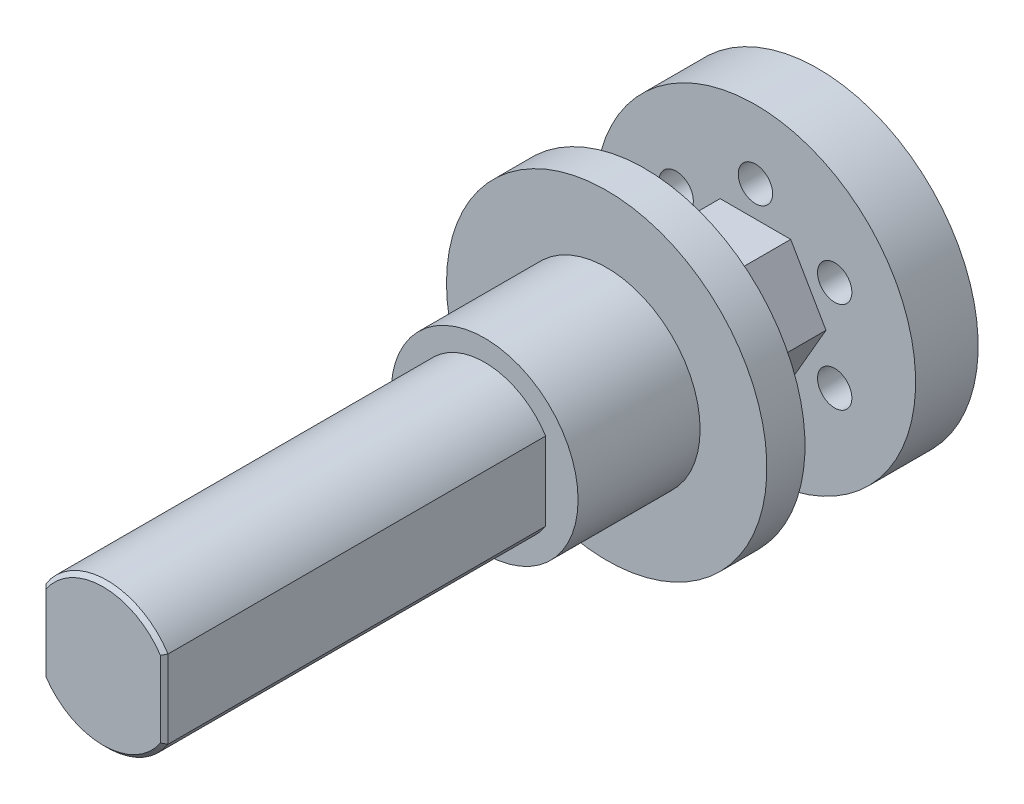
ISO-10303-21;
HEADER;
FILE_DESCRIPTION(('STEP AP214'),'2;1');
FILE_NAME('part.step','',(''),(''),'','','');
FILE_SCHEMA(('AUTOMOTIVE_DESIGN { 1 0 10303 214 1 1 1 1 }'));
ENDSEC;
DATA;
#1=APPLICATION_CONTEXT('core data for automotive mechanical design processes');
#2=APPLICATION_PROTOCOL_DEFINITION('international standard','automotive_design',2000,#1);
#3=PRODUCT_CONTEXT('',#1,'mechanical');
#4=PRODUCT('Part','Part','',(#3));
#5=PRODUCT_RELATED_PRODUCT_CATEGORY('part','',(#4));
#6=PRODUCT_DEFINITION_FORMATION('','',#4);
#7=PRODUCT_DEFINITION_CONTEXT('part definition',#1,'design');
#8=PRODUCT_DEFINITION('design','',#6,#7);
#9=PRODUCT_DEFINITION_SHAPE('','',#8);
#10=(LENGTH_UNIT() NAMED_UNIT(*) SI_UNIT(.MILLI.,.METRE.));
#11=(NAMED_UNIT(*) PLANE_ANGLE_UNIT() SI_UNIT($,.RADIAN.));
#12=(NAMED_UNIT(*) SI_UNIT($,.STERADIAN.) SOLID_ANGLE_UNIT());
#13=UNCERTAINTY_MEASURE_WITH_UNIT(LENGTH_MEASURE(1.E-05),#10,'distance_accuracy_value','');
#14=(GEOMETRIC_REPRESENTATION_CONTEXT(3) GLOBAL_UNCERTAINTY_ASSIGNED_CONTEXT((#13)) GLOBAL_UNIT_ASSIGNED_CONTEXT((#10,
#11,#12)) REPRESENTATION_CONTEXT('',''));
#15=CARTESIAN_POINT('',(0.,0.,0.));
#16=DIRECTION('',(0.,0.,1.));
#17=DIRECTION('',(1.,0.,0.));
#18=AXIS2_PLACEMENT_3D('',#15,#16,#17);
#19=CARTESIAN_POINT('',(0.,0.,116.370057685089));
#20=DIRECTION('',(0.,0.,-1.));
#21=DIRECTION('',(-1.,0.,0.));
#22=AXIS2_PLACEMENT_3D('',#19,#20,#21);
#23=CYLINDRICAL_SURFACE('',#22,9.5);
#24=DIRECTION('',(0.,0.,1.));
#25=VECTOR('',#24,1.);
#26=CARTESIAN_POINT('',(-8.,5.1234753829798,-12.5173900178193));
#27=LINE('',#26,#25);
#28=CARTESIAN_POINT('',(-8.,5.1234753829798,39.5));
#29=VERTEX_POINT('',#28);
#30=CARTESIAN_POINT('',(-8.,5.1234753829798,89.));
#31=VERTEX_POINT('',#30);
#32=EDGE_CURVE('E248',#29,#31,#27,.T.);
#33=ORIENTED_EDGE('',*,*,#32,.T.);
#34=CARTESIAN_POINT('',(0.,0.,89.));
#35=DIRECTION('',(0.,0.,1.));
#36=DIRECTION('',(1.,0.,0.));
#37=AXIS2_PLACEMENT_3D('',#34,#35,#36);
#38=CIRCLE('',#37,9.5);
#39=CARTESIAN_POINT('',(8.,5.1234753829798,89.));
#40=VERTEX_POINT('',#39);
#41=EDGE_CURVE('E13',#31,#40,#38,.F.);
#42=ORIENTED_EDGE('',*,*,#41,.T.);
#43=DIRECTION('',(0.,0.,1.));
#44=VECTOR('',#43,1.);
#45=CARTESIAN_POINT('',(8.,5.1234753829798,-12.5173900178193));
#46=LINE('',#45,#44);
#47=CARTESIAN_POINT('',(8.,5.1234753829798,39.5));
#48=VERTEX_POINT('',#47);
#49=EDGE_CURVE('E264',#48,#40,#46,.T.);
#50=ORIENTED_EDGE('',*,*,#49,.F.);
#51=CARTESIAN_POINT('',(0.,0.,39.5));
#52=DIRECTION('',(0.,0.,1.));
#53=DIRECTION('',(1.,0.,0.));
#54=AXIS2_PLACEMENT_3D('',#51,#52,#53);
#55=CIRCLE('',#54,9.5);
#56=EDGE_CURVE('E262',#48,#29,#55,.T.);
#57=ORIENTED_EDGE('',*,*,#56,.T.);
#58=EDGE_LOOP('',(#33,#42,#50,#57));
#59=FACE_BOUND('',#58,.T.);
#60=ADVANCED_FACE('F154',(#59),#23,.T.);
#61=DIRECTION('',(0.,0.,1.));
#62=VECTOR('',#61,1.);
#63=CARTESIAN_POINT('',(8.,-5.1234753829798,-12.5173900178193));
#64=LINE('',#63,#62);
#65=CARTESIAN_POINT('',(8.,-5.1234753829798,39.5));
#66=VERTEX_POINT('',#65);
#67=CARTESIAN_POINT('',(8.,-5.1234753829798,89.));
#68=VERTEX_POINT('',#67);
#69=EDGE_CURVE('E552',#66,#68,#64,.T.);
#70=ORIENTED_EDGE('',*,*,#69,.T.);
#71=CARTESIAN_POINT('',(0.,0.,89.));
#72=DIRECTION('',(0.,0.,1.));
#73=DIRECTION('',(1.,0.,0.));
#74=AXIS2_PLACEMENT_3D('',#71,#72,#73);
#75=CIRCLE('',#74,9.5);
#76=CARTESIAN_POINT('',(-8.,-5.1234753829798,89.));
#77=VERTEX_POINT('',#76);
#78=EDGE_CURVE('E184',#68,#77,#75,.F.);
#79=ORIENTED_EDGE('',*,*,#78,.T.);
#80=DIRECTION('',(0.,0.,1.));
#81=VECTOR('',#80,1.);
#82=CARTESIAN_POINT('',(-8.,-5.1234753829798,-12.5173900178193));
#83=LINE('',#82,#81);
#84=CARTESIAN_POINT('',(-8.,-5.1234753829798,39.5));
#85=VERTEX_POINT('',#84);
#86=EDGE_CURVE('E255',#85,#77,#83,.T.);
#87=ORIENTED_EDGE('',*,*,#86,.F.);
#88=EDGE_CURVE('E263',#85,#66,#55,.T.);
#89=ORIENTED_EDGE('',*,*,#88,.T.);
#90=EDGE_LOOP('',(#70,#79,#87,#89));
#91=FACE_BOUND('',#90,.T.);
#92=ADVANCED_FACE('F435',(#91),#23,.T.);
#93=CARTESIAN_POINT('',(0.,0.,89.5));
#94=DIRECTION('',(0.,0.,1.));
#95=DIRECTION('',(1.,0.,0.));
#96=AXIS2_PLACEMENT_3D('',#93,#94,#95);
#97=PLANE('',#96);
#98=CARTESIAN_POINT('',(0.,0.,89.5));
#99=DIRECTION('',(0.,0.,1.));
#100=DIRECTION('',(1.,0.,0.));
#101=AXIS2_PLACEMENT_3D('',#98,#99,#100);
#102=CIRCLE('',#101,8.99999999999998);
#103=CARTESIAN_POINT('',(-7.49999999999998,-4.9749371855331,89.5));
#104=VERTEX_POINT('',#103);
#105=CARTESIAN_POINT('',(7.49999999999998,-4.9749371855331,89.5));
#106=VERTEX_POINT('',#105);
#107=EDGE_CURVE('E384',#104,#106,#102,.T.);
#108=ORIENTED_EDGE('',*,*,#107,.T.);
#109=DIRECTION('',(0.,1.,0.));
#110=VECTOR('',#109,1.);
#111=CARTESIAN_POINT('',(7.49999999999998,0.,89.5));
#112=LINE('',#111,#110);
#113=CARTESIAN_POINT('',(7.49999999999998,4.9749371855331,89.5));
#114=VERTEX_POINT('',#113);
#115=EDGE_CURVE('E386',#106,#114,#112,.T.);
#116=ORIENTED_EDGE('',*,*,#115,.T.);
#117=CARTESIAN_POINT('',(0.,0.,89.5));
#118=DIRECTION('',(0.,0.,1.));
#119=DIRECTION('',(1.,0.,0.));
#120=AXIS2_PLACEMENT_3D('',#117,#118,#119);
#121=CIRCLE('',#120,8.99999999999998);
#122=CARTESIAN_POINT('',(-7.49999999999998,4.9749371855331,89.5));
#123=VERTEX_POINT('',#122);
#124=EDGE_CURVE('E378',#114,#123,#121,.T.);
#125=ORIENTED_EDGE('',*,*,#124,.T.);
#126=DIRECTION('',(0.,-1.,0.));
#127=VECTOR('',#126,1.);
#128=CARTESIAN_POINT('',(-7.49999999999998,0.,89.5));
#129=LINE('',#128,#127);
#130=EDGE_CURVE('E382',#123,#104,#129,.T.);
#131=ORIENTED_EDGE('',*,*,#130,.T.);
#132=EDGE_LOOP('',(#108,#116,#125,#131));
#133=FACE_BOUND('',#132,.T.);
#134=ADVANCED_FACE('F440',(#133),#97,.T.);
#135=CARTESIAN_POINT('',(0.,0.,23.5));
#136=DIRECTION('',(0.,0.,1.));
#137=DIRECTION('',(1.,0.,0.));
#138=AXIS2_PLACEMENT_3D('',#135,#136,#137);
#139=CYLINDRICAL_SURFACE('',#138,12.25);
#140=CARTESIAN_POINT('',(0.,0.,23.5));
#141=DIRECTION('',(0.,0.,-1.));
#142=DIRECTION('',(-1.,0.,0.));
#143=AXIS2_PLACEMENT_3D('',#140,#141,#142);
#144=CIRCLE('',#143,12.25);
#145=CARTESIAN_POINT('',(-12.25,0.,23.5));
#146=VERTEX_POINT('',#145);
#147=EDGE_CURVE('E370',#146,#146,#144,.F.);
#148=ORIENTED_EDGE('',*,*,#147,.T.);
#149=EDGE_LOOP('',(#148));
#150=FACE_BOUND('',#149,.T.);
#151=CARTESIAN_POINT('',(0.,0.,39.5));
#152=DIRECTION('',(0.,0.,1.));
#153=DIRECTION('',(1.,0.,0.));
#154=AXIS2_PLACEMENT_3D('',#151,#152,#153);
#155=CIRCLE('',#154,12.25);
#156=CARTESIAN_POINT('',(12.25,0.,39.5));
#157=VERTEX_POINT('',#156);
#158=EDGE_CURVE('E375',#157,#157,#155,.T.);
#159=ORIENTED_EDGE('',*,*,#158,.F.);
#160=EDGE_LOOP('',(#159));
#161=FACE_BOUND('',#160,.T.);
#162=ADVANCED_FACE('F527',(#150,#161),#139,.T.);
#163=CARTESIAN_POINT('',(0.,0.,39.5));
#164=DIRECTION('',(0.,0.,1.));
#165=DIRECTION('',(1.,0.,0.));
#166=AXIS2_PLACEMENT_3D('',#163,#164,#165);
#167=PLANE('',#166);
#168=ORIENTED_EDGE('',*,*,#158,.T.);
#169=EDGE_LOOP('',(#168));
#170=FACE_BOUND('',#169,.T.);
#171=DIRECTION('',(0.,-1.,0.));
#172=VECTOR('',#171,1.);
#173=CARTESIAN_POINT('',(8.,-5.1234753829798,39.5));
#174=LINE('',#173,#172);
#175=EDGE_CURVE('E273',#48,#66,#174,.T.);
#176=ORIENTED_EDGE('',*,*,#175,.T.);
#177=ORIENTED_EDGE('',*,*,#88,.F.);
#178=DIRECTION('',(0.,1.,0.));
#179=VECTOR('',#178,1.);
#180=CARTESIAN_POINT('',(-8.,5.1234753829798,39.5));
#181=LINE('',#180,#179);
#182=EDGE_CURVE('E251',#85,#29,#181,.T.);
#183=ORIENTED_EDGE('',*,*,#182,.T.);
#184=ORIENTED_EDGE('',*,*,#56,.F.);
#185=EDGE_LOOP('',(#176,#177,#183,#184));
#186=FACE_BOUND('',#185,.T.);
#187=ADVANCED_FACE('F261',(#170,#186),#167,.T.);
#188=CARTESIAN_POINT('',(0.,0.,18.5));
#189=DIRECTION('',(0.,0.,1.));
#190=DIRECTION('',(1.,0.,0.));
#191=AXIS2_PLACEMENT_3D('',#188,#189,#190);
#192=CYLINDRICAL_SURFACE('',#191,21.);
#193=CARTESIAN_POINT('',(0.,0.,18.5));
#194=DIRECTION('',(0.,0.,-1.));
#195=DIRECTION('',(-1.,0.,0.));
#196=AXIS2_PLACEMENT_3D('',#193,#194,#195);
#197=CIRCLE('',#196,21.);
#198=CARTESIAN_POINT('',(-21.,0.,18.5));
#199=VERTEX_POINT('',#198);
#200=EDGE_CURVE('E367',#199,#199,#197,.T.);
#201=ORIENTED_EDGE('',*,*,#200,.F.);
#202=EDGE_LOOP('',(#201));
#203=FACE_BOUND('',#202,.T.);
#204=CARTESIAN_POINT('',(0.,0.,23.5));
#205=DIRECTION('',(0.,0.,-1.));
#206=DIRECTION('',(-1.,0.,0.));
#207=AXIS2_PLACEMENT_3D('',#204,#205,#206);
#208=CIRCLE('',#207,21.);
#209=CARTESIAN_POINT('',(-21.,0.,23.5));
#210=VERTEX_POINT('',#209);
#211=EDGE_CURVE('E366',#210,#210,#208,.T.);
#212=ORIENTED_EDGE('',*,*,#211,.T.);
#213=EDGE_LOOP('',(#212));
#214=FACE_BOUND('',#213,.T.);
#215=ADVANCED_FACE('F517',(#203,#214),#192,.T.);
#216=CARTESIAN_POINT('',(0.,0.,18.5));
#217=DIRECTION('',(0.,0.,-1.));
#218=DIRECTION('',(-1.,0.,0.));
#219=AXIS2_PLACEMENT_3D('',#216,#217,#218);
#220=PLANE('',#219);
#221=DIRECTION('',(1.,0.,0.));
#222=VECTOR('',#221,1.);
#223=CARTESIAN_POINT('',(-4.62500000000005,8.01073498500603,18.5));
#224=LINE('',#223,#222);
#225=CARTESIAN_POINT('',(-4.62500000000005,8.01073498500603,18.5));
#226=VERTEX_POINT('',#225);
#227=CARTESIAN_POINT('',(4.62500000000005,8.01073498500603,18.5));
#228=VERTEX_POINT('',#227);
#229=EDGE_CURVE('E301',#226,#228,#224,.T.);
#230=ORIENTED_EDGE('',*,*,#229,.F.);
#231=DIRECTION('',(0.499999999999997,0.86602540378444,0.));
#232=VECTOR('',#231,1.);
#233=CARTESIAN_POINT('',(-9.25,0.,18.5));
#234=LINE('',#233,#232);
#235=CARTESIAN_POINT('',(-9.25,0.,18.5));
#236=VERTEX_POINT('',#235);
#237=EDGE_CURVE('E298',#236,#226,#234,.T.);
#238=ORIENTED_EDGE('',*,*,#237,.F.);
#239=DIRECTION('',(-0.499999999999998,0.86602540378444,0.));
#240=VECTOR('',#239,1.);
#241=CARTESIAN_POINT('',(-4.62500000000004,-8.01073498500603,18.5));
#242=LINE('',#241,#240);
#243=CARTESIAN_POINT('',(-4.62500000000005,-8.01073498500603,18.5));
#244=VERTEX_POINT('',#243);
#245=EDGE_CURVE('E295',#244,#236,#242,.T.);
#246=ORIENTED_EDGE('',*,*,#245,.F.);
#247=DIRECTION('',(-1.,0.,0.));
#248=VECTOR('',#247,1.);
#249=CARTESIAN_POINT('',(4.62500000000004,-8.01073498500603,18.5));
#250=LINE('',#249,#248);
#251=CARTESIAN_POINT('',(4.62500000000004,-8.01073498500603,18.5));
#252=VERTEX_POINT('',#251);
#253=EDGE_CURVE('E293',#252,#244,#250,.T.);
#254=ORIENTED_EDGE('',*,*,#253,.F.);
#255=DIRECTION('',(-0.499999999999998,-0.86602540378444,0.));
#256=VECTOR('',#255,1.);
#257=CARTESIAN_POINT('',(9.25,0.,18.5));
#258=LINE('',#257,#256);
#259=CARTESIAN_POINT('',(9.25,0.,18.5));
#260=VERTEX_POINT('',#259);
#261=EDGE_CURVE('E290',#260,#252,#258,.T.);
#262=ORIENTED_EDGE('',*,*,#261,.F.);
#263=DIRECTION('',(0.499999999999997,-0.86602540378444,0.));
#264=VECTOR('',#263,1.);
#265=CARTESIAN_POINT('',(4.62500000000005,8.01073498500603,18.5));
#266=LINE('',#265,#264);
#267=EDGE_CURVE('E287',#228,#260,#266,.T.);
#268=ORIENTED_EDGE('',*,*,#267,.F.);
#269=EDGE_LOOP('',(#230,#238,#246,#254,#262,#268));
#270=FACE_BOUND('',#269,.T.);
#271=ORIENTED_EDGE('',*,*,#200,.T.);
#272=EDGE_LOOP('',(#271));
#273=FACE_BOUND('',#272,.T.);
#274=ADVANCED_FACE('F514',(#270,#273),#220,.T.);
#275=CARTESIAN_POINT('',(0.,0.,23.5));
#276=DIRECTION('',(0.,0.,-1.));
#277=DIRECTION('',(-1.,0.,0.));
#278=AXIS2_PLACEMENT_3D('',#275,#276,#277);
#279=PLANE('',#278);
#280=ORIENTED_EDGE('',*,*,#147,.F.);
#281=EDGE_LOOP('',(#280));
#282=FACE_BOUND('',#281,.T.);
#283=ORIENTED_EDGE('',*,*,#211,.F.);
#284=EDGE_LOOP('',(#283));
#285=FACE_BOUND('',#284,.T.);
#286=ADVANCED_FACE('F449',(#282,#285),#279,.F.);
#287=CARTESIAN_POINT('',(-4.62500000000005,8.01073498500603,-55.9909393158667));
#288=DIRECTION('',(0.,-1.,0.));
#289=DIRECTION('',(0.,0.,-1.));
#290=AXIS2_PLACEMENT_3D('',#287,#288,#289);
#291=PLANE('',#290);
#292=DIRECTION('',(0.,0.,1.));
#293=VECTOR('',#292,1.);
#294=CARTESIAN_POINT('',(-4.62500000000005,8.01073498500603,-55.9909393158667));
#295=LINE('',#294,#293);
#296=CARTESIAN_POINT('',(-4.62500000000005,8.01073498500603,4.));
#297=VERTEX_POINT('',#296);
#298=EDGE_CURVE('E306',#297,#226,#295,.T.);
#299=ORIENTED_EDGE('',*,*,#298,.T.);
#300=ORIENTED_EDGE('',*,*,#229,.T.);
#301=DIRECTION('',(0.,0.,1.));
#302=VECTOR('',#301,1.);
#303=CARTESIAN_POINT('',(4.62500000000005,8.01073498500603,-55.9909393158667));
#304=LINE('',#303,#302);
#305=CARTESIAN_POINT('',(4.62500000000005,8.01073498500603,4.));
#306=VERTEX_POINT('',#305);
#307=EDGE_CURVE('E304',#306,#228,#304,.T.);
#308=ORIENTED_EDGE('',*,*,#307,.F.);
#309=DIRECTION('',(1.,0.,0.));
#310=VECTOR('',#309,1.);
#311=CARTESIAN_POINT('',(-4.62500000000005,8.01073498500603,4.));
#312=LINE('',#311,#310);
#313=EDGE_CURVE('E317',#297,#306,#312,.T.);
#314=ORIENTED_EDGE('',*,*,#313,.F.);
#315=EDGE_LOOP('',(#299,#300,#308,#314));
#316=FACE_BOUND('',#315,.T.);
#317=ADVANCED_FACE('F445',(#316),#291,.F.);
#318=CARTESIAN_POINT('',(-9.25,0.,-55.9909393158667));
#319=DIRECTION('',(0.86602540378444,-0.499999999999997,0.));
#320=DIRECTION('',(0.499999999999997,0.86602540378444,0.));
#321=AXIS2_PLACEMENT_3D('',#318,#319,#320);
#322=PLANE('',#321);
#323=DIRECTION('',(0.,0.,1.));
#324=VECTOR('',#323,1.);
#325=CARTESIAN_POINT('',(-9.25,0.,-55.9909393158667));
#326=LINE('',#325,#324);
#327=CARTESIAN_POINT('',(-9.25,0.,4.));
#328=VERTEX_POINT('',#327);
#329=EDGE_CURVE('E308',#328,#236,#326,.T.);
#330=ORIENTED_EDGE('',*,*,#329,.T.);
#331=ORIENTED_EDGE('',*,*,#237,.T.);
#332=ORIENTED_EDGE('',*,*,#298,.F.);
#333=DIRECTION('',(0.499999999999997,0.86602540378444,0.));
#334=VECTOR('',#333,1.);
#335=CARTESIAN_POINT('',(-9.25,0.,4.));
#336=LINE('',#335,#334);
#337=EDGE_CURVE('E268',#328,#297,#336,.T.);
#338=ORIENTED_EDGE('',*,*,#337,.F.);
#339=EDGE_LOOP('',(#330,#331,#332,#338));
#340=FACE_BOUND('',#339,.T.);
#341=ADVANCED_FACE('F448',(#340),#322,.F.);
#342=CARTESIAN_POINT('',(-4.62500000000004,-8.01073498500603,-55.9909393158667));
#343=DIRECTION('',(0.86602540378444,0.499999999999998,0.));
#344=DIRECTION('',(-0.499999999999998,0.86602540378444,0.));
#345=AXIS2_PLACEMENT_3D('',#342,#343,#344);
#346=PLANE('',#345);
#347=DIRECTION('',(0.,0.,1.));
#348=VECTOR('',#347,1.);
#349=CARTESIAN_POINT('',(-4.62500000000004,-8.01073498500603,-55.9909393158667));
#350=LINE('',#349,#348);
#351=CARTESIAN_POINT('',(-4.62500000000004,-8.01073498500603,4.));
#352=VERTEX_POINT('',#351);
#353=EDGE_CURVE('E310',#352,#244,#350,.T.);
#354=ORIENTED_EDGE('',*,*,#353,.T.);
#355=ORIENTED_EDGE('',*,*,#245,.T.);
#356=ORIENTED_EDGE('',*,*,#329,.F.);
#357=DIRECTION('',(-0.499999999999998,0.86602540378444,0.));
#358=VECTOR('',#357,1.);
#359=CARTESIAN_POINT('',(-4.62500000000004,-8.01073498500603,4.));
#360=LINE('',#359,#358);
#361=EDGE_CURVE('E271',#352,#328,#360,.T.);
#362=ORIENTED_EDGE('',*,*,#361,.F.);
#363=EDGE_LOOP('',(#354,#355,#356,#362));
#364=FACE_BOUND('',#363,.T.);
#365=ADVANCED_FACE('F453',(#364),#346,.F.);
#366=CARTESIAN_POINT('',(4.62500000000004,-8.01073498500603,-55.9909393158667));
#367=DIRECTION('',(0.,1.,0.));
#368=DIRECTION('',(-1.,0.,0.));
#369=AXIS2_PLACEMENT_3D('',#366,#367,#368);
#370=PLANE('',#369);
#371=DIRECTION('',(0.,0.,1.));
#372=VECTOR('',#371,1.);
#373=CARTESIAN_POINT('',(4.62500000000004,-8.01073498500603,-55.9909393158667));
#374=LINE('',#373,#372);
#375=CARTESIAN_POINT('',(4.62500000000004,-8.01073498500603,4.));
#376=VERTEX_POINT('',#375);
#377=EDGE_CURVE('E313',#376,#252,#374,.T.);
#378=ORIENTED_EDGE('',*,*,#377,.T.);
#379=ORIENTED_EDGE('',*,*,#253,.T.);
#380=ORIENTED_EDGE('',*,*,#353,.F.);
#381=DIRECTION('',(-1.,0.,0.));
#382=VECTOR('',#381,1.);
#383=CARTESIAN_POINT('',(4.62500000000004,-8.01073498500603,4.));
#384=LINE('',#383,#382);
#385=EDGE_CURVE('E278',#376,#352,#384,.T.);
#386=ORIENTED_EDGE('',*,*,#385,.F.);
#387=EDGE_LOOP('',(#378,#379,#380,#386));
#388=FACE_BOUND('',#387,.T.);
#389=ADVANCED_FACE('F457',(#388),#370,.F.);
#390=CARTESIAN_POINT('',(9.25,0.,-55.9909393158667));
#391=DIRECTION('',(-0.86602540378444,0.499999999999998,0.));
#392=DIRECTION('',(-0.499999999999998,-0.86602540378444,0.));
#393=AXIS2_PLACEMENT_3D('',#390,#391,#392);
#394=PLANE('',#393);
#395=DIRECTION('',(0.,0.,1.));
#396=VECTOR('',#395,1.);
#397=CARTESIAN_POINT('',(9.25,0.,-55.9909393158667));
#398=LINE('',#397,#396);
#399=CARTESIAN_POINT('',(9.25,0.,4.));
#400=VERTEX_POINT('',#399);
#401=EDGE_CURVE('E315',#400,#260,#398,.T.);
#402=ORIENTED_EDGE('',*,*,#401,.T.);
#403=ORIENTED_EDGE('',*,*,#261,.T.);
#404=ORIENTED_EDGE('',*,*,#377,.F.);
#405=DIRECTION('',(-0.499999999999998,-0.86602540378444,0.));
#406=VECTOR('',#405,1.);
#407=CARTESIAN_POINT('',(9.25,0.,4.));
#408=LINE('',#407,#406);
#409=EDGE_CURVE('E281',#400,#376,#408,.T.);
#410=ORIENTED_EDGE('',*,*,#409,.F.);
#411=EDGE_LOOP('',(#402,#403,#404,#410));
#412=FACE_BOUND('',#411,.T.);
#413=ADVANCED_FACE('F461',(#412),#394,.F.);
#414=CARTESIAN_POINT('',(4.62500000000005,8.01073498500603,-55.9909393158667));
#415=DIRECTION('',(-0.86602540378444,-0.499999999999997,0.));
#416=DIRECTION('',(0.499999999999997,-0.86602540378444,0.));
#417=AXIS2_PLACEMENT_3D('',#414,#415,#416);
#418=PLANE('',#417);
#419=ORIENTED_EDGE('',*,*,#307,.T.);
#420=ORIENTED_EDGE('',*,*,#267,.T.);
#421=ORIENTED_EDGE('',*,*,#401,.F.);
#422=DIRECTION('',(0.499999999999997,-0.86602540378444,0.));
#423=VECTOR('',#422,1.);
#424=CARTESIAN_POINT('',(4.62500000000005,8.01073498500603,4.));
#425=LINE('',#424,#423);
#426=EDGE_CURVE('E284',#306,#400,#425,.T.);
#427=ORIENTED_EDGE('',*,*,#426,.F.);
#428=EDGE_LOOP('',(#419,#420,#421,#427));
#429=FACE_BOUND('',#428,.T.);
#430=ADVANCED_FACE('F465',(#429),#418,.F.);
#431=CARTESIAN_POINT('',(0.,0.,-2.2));
#432=DIRECTION('',(0.,0.,-1.));
#433=DIRECTION('',(-1.,0.,0.));
#434=AXIS2_PLACEMENT_3D('',#431,#432,#433);
#435=CYLINDRICAL_SURFACE('',#434,20.);
#436=CARTESIAN_POINT('',(0.,0.,-2.2));
#437=DIRECTION('',(0.,0.,-1.));
#438=DIRECTION('',(-1.,0.,0.));
#439=AXIS2_PLACEMENT_3D('',#436,#437,#438);
#440=CIRCLE('',#439,20.);
#441=CARTESIAN_POINT('',(-20.,0.,-2.2));
#442=VERTEX_POINT('',#441);
#443=EDGE_CURVE('E321',#442,#442,#440,.T.);
#444=ORIENTED_EDGE('',*,*,#443,.F.);
#445=EDGE_LOOP('',(#444));
#446=FACE_BOUND('',#445,.T.);
#447=CARTESIAN_POINT('',(0.,0.,-4.2));
#448=DIRECTION('',(0.,0.,-1.));
#449=DIRECTION('',(-1.,0.,0.));
#450=AXIS2_PLACEMENT_3D('',#447,#448,#449);
#451=CIRCLE('',#450,20.);
#452=CARTESIAN_POINT('',(-20.,0.,-4.2));
#453=VERTEX_POINT('',#452);
#454=EDGE_CURVE('E320',#453,#453,#451,.T.);
#455=ORIENTED_EDGE('',*,*,#454,.T.);
#456=EDGE_LOOP('',(#455));
#457=FACE_BOUND('',#456,.T.);
#458=ADVANCED_FACE('F469',(#446,#457),#435,.F.);
#459=CARTESIAN_POINT('',(0.,0.,-4.2));
#460=DIRECTION('',(0.,0.,-1.));
#461=DIRECTION('',(-1.,0.,0.));
#462=AXIS2_PLACEMENT_3D('',#459,#460,#461);
#463=PLANE('',#462);
#464=ORIENTED_EDGE('',*,*,#454,.F.);
#465=EDGE_LOOP('',(#464));
#466=FACE_BOUND('',#465,.T.);
#467=CARTESIAN_POINT('',(0.,0.,-4.2));
#468=DIRECTION('',(0.,0.,-1.));
#469=DIRECTION('',(-1.,0.,0.));
#470=AXIS2_PLACEMENT_3D('',#467,#468,#469);
#471=CIRCLE('',#470,21.);
#472=CARTESIAN_POINT('',(-21.,0.,-4.2));
#473=VERTEX_POINT('',#472);
#474=EDGE_CURVE('E342',#473,#473,#471,.T.);
#475=ORIENTED_EDGE('',*,*,#474,.T.);
#476=EDGE_LOOP('',(#475));
#477=FACE_BOUND('',#476,.T.);
#478=ADVANCED_FACE('F475',(#466,#477),#463,.T.);
#479=CARTESIAN_POINT('',(0.,0.,-2.2));
#480=DIRECTION('',(0.,0.,-1.));
#481=DIRECTION('',(-1.,0.,0.));
#482=AXIS2_PLACEMENT_3D('',#479,#480,#481);
#483=PLANE('',#482);
#484=ORIENTED_EDGE('',*,*,#443,.T.);
#485=EDGE_LOOP('',(#484));
#486=FACE_BOUND('',#485,.T.);
#487=CARTESIAN_POINT('',(10.3923048454133,-5.99999999999991,-2.2));
#488=DIRECTION('',(0.,0.,-1.));
#489=DIRECTION('',(-1.,0.,0.));
#490=AXIS2_PLACEMENT_3D('',#487,#488,#489);
#491=CIRCLE('',#490,2.25);
#492=CARTESIAN_POINT('',(8.14230484541332,-5.99999999999991,-2.2));
#493=VERTEX_POINT('',#492);
#494=EDGE_CURVE('E324',#493,#493,#491,.F.);
#495=ORIENTED_EDGE('',*,*,#494,.T.);
#496=EDGE_LOOP('',(#495));
#497=FACE_BOUND('',#496,.T.);
#498=CARTESIAN_POINT('',(0.,-12.,-2.2));
#499=DIRECTION('',(0.,0.,-1.));
#500=DIRECTION('',(-1.,0.,0.));
#501=AXIS2_PLACEMENT_3D('',#498,#499,#500);
#502=CIRCLE('',#501,2.25);
#503=CARTESIAN_POINT('',(-2.24999999999992,-12.,-2.2));
#504=VERTEX_POINT('',#503);
#505=EDGE_CURVE('E327',#504,#504,#502,.F.);
#506=ORIENTED_EDGE('',*,*,#505,.T.);
#507=EDGE_LOOP('',(#506));
#508=FACE_BOUND('',#507,.T.);
#509=CARTESIAN_POINT('',(-10.3923048454132,-6.00000000000005,-2.2));
#510=DIRECTION('',(0.,0.,-1.));
#511=DIRECTION('',(-1.,0.,0.));
#512=AXIS2_PLACEMENT_3D('',#509,#510,#511);
#513=CIRCLE('',#512,2.25);
#514=CARTESIAN_POINT('',(-12.6423048454132,-6.00000000000005,-2.2));
#515=VERTEX_POINT('',#514);
#516=EDGE_CURVE('E330',#515,#515,#513,.F.);
#517=ORIENTED_EDGE('',*,*,#516,.T.);
#518=EDGE_LOOP('',(#517));
#519=FACE_BOUND('',#518,.T.);
#520=CARTESIAN_POINT('',(-10.3923048454133,5.99999999999998,-2.2));
#521=DIRECTION('',(0.,0.,-1.));
#522=DIRECTION('',(-1.,0.,0.));
#523=AXIS2_PLACEMENT_3D('',#520,#521,#522);
#524=CIRCLE('',#523,2.25);
#525=CARTESIAN_POINT('',(-12.6423048454133,5.99999999999998,-2.2));
#526=VERTEX_POINT('',#525);
#527=EDGE_CURVE('E333',#526,#526,#524,.F.);
#528=ORIENTED_EDGE('',*,*,#527,.T.);
#529=EDGE_LOOP('',(#528));
#530=FACE_BOUND('',#529,.T.);
#531=CARTESIAN_POINT('',(0.,12.,-2.2));
#532=DIRECTION('',(0.,0.,-1.));
#533=DIRECTION('',(-1.,0.,0.));
#534=AXIS2_PLACEMENT_3D('',#531,#532,#533);
#535=CIRCLE('',#534,2.25);
#536=CARTESIAN_POINT('',(-2.25,12.,-2.2));
#537=VERTEX_POINT('',#536);
#538=EDGE_CURVE('E336',#537,#537,#535,.F.);
#539=ORIENTED_EDGE('',*,*,#538,.T.);
#540=EDGE_LOOP('',(#539));
#541=FACE_BOUND('',#540,.T.);
#542=CARTESIAN_POINT('',(10.3923048454132,6.00000000000012,-2.2));
#543=DIRECTION('',(0.,0.,-1.));
#544=DIRECTION('',(-1.,0.,0.));
#545=AXIS2_PLACEMENT_3D('',#542,#543,#544);
#546=CIRCLE('',#545,2.25);
#547=CARTESIAN_POINT('',(8.1423048454132,6.00000000000012,-2.2));
#548=VERTEX_POINT('',#547);
#549=EDGE_CURVE('E339',#548,#548,#546,.F.);
#550=ORIENTED_EDGE('',*,*,#549,.T.);
#551=EDGE_LOOP('',(#550));
#552=FACE_BOUND('',#551,.T.);
#553=ADVANCED_FACE('F471',(#486,#497,#508,#519,#530,#541,#552),#483,.T.);
#554=CARTESIAN_POINT('',(0.,0.,4.));
#555=DIRECTION('',(0.,0.,-1.));
#556=DIRECTION('',(-1.,0.,0.));
#557=AXIS2_PLACEMENT_3D('',#554,#555,#556);
#558=CYLINDRICAL_SURFACE('',#557,21.);
#559=CARTESIAN_POINT('',(0.,0.,4.));
#560=DIRECTION('',(0.,0.,-1.));
#561=DIRECTION('',(-1.,0.,0.));
#562=AXIS2_PLACEMENT_3D('',#559,#560,#561);
#563=CIRCLE('',#562,21.);
#564=CARTESIAN_POINT('',(-21.,0.,4.));
#565=VERTEX_POINT('',#564);
#566=EDGE_CURVE('E363',#565,#565,#563,.T.);
#567=ORIENTED_EDGE('',*,*,#566,.T.);
#568=EDGE_LOOP('',(#567));
#569=FACE_BOUND('',#568,.T.);
#570=ORIENTED_EDGE('',*,*,#474,.F.);
#571=EDGE_LOOP('',(#570));
#572=FACE_BOUND('',#571,.T.);
#573=ADVANCED_FACE('F474',(#569,#572),#558,.T.);
#574=CARTESIAN_POINT('',(10.3923048454132,6.00000000000012,4.));
#575=DIRECTION('',(0.,0.,-1.));
#576=DIRECTION('',(-1.,0.,0.));
#577=AXIS2_PLACEMENT_3D('',#574,#575,#576);
#578=CYLINDRICAL_SURFACE('',#577,2.25);
#579=CARTESIAN_POINT('',(10.3923048454132,6.00000000000012,4.));
#580=DIRECTION('',(0.,0.,-1.));
#581=DIRECTION('',(-1.,0.,0.));
#582=AXIS2_PLACEMENT_3D('',#579,#580,#581);
#583=CIRCLE('',#582,2.25);
#584=CARTESIAN_POINT('',(8.1423048454132,6.00000000000012,4.));
#585=VERTEX_POINT('',#584);
#586=EDGE_CURVE('E360',#585,#585,#583,.T.);
#587=ORIENTED_EDGE('',*,*,#586,.F.);
#588=EDGE_LOOP('',(#587));
#589=FACE_BOUND('',#588,.T.);
#590=ORIENTED_EDGE('',*,*,#549,.F.);
#591=EDGE_LOOP('',(#590));
#592=FACE_BOUND('',#591,.T.);
#593=ADVANCED_FACE('F503',(#589,#592),#578,.F.);
#594=CARTESIAN_POINT('',(0.,12.,4.));
#595=DIRECTION('',(0.,0.,-1.));
#596=DIRECTION('',(-1.,0.,0.));
#597=AXIS2_PLACEMENT_3D('',#594,#595,#596);
#598=CYLINDRICAL_SURFACE('',#597,2.25);
#599=CARTESIAN_POINT('',(0.,12.,4.));
#600=DIRECTION('',(0.,0.,-1.));
#601=DIRECTION('',(-1.,0.,0.));
#602=AXIS2_PLACEMENT_3D('',#599,#600,#601);
#603=CIRCLE('',#602,2.25);
#604=CARTESIAN_POINT('',(-2.25,12.,4.));
#605=VERTEX_POINT('',#604);
#606=EDGE_CURVE('E357',#605,#605,#603,.T.);
#607=ORIENTED_EDGE('',*,*,#606,.F.);
#608=EDGE_LOOP('',(#607));
#609=FACE_BOUND('',#608,.T.);
#610=ORIENTED_EDGE('',*,*,#538,.F.);
#611=EDGE_LOOP('',(#610));
#612=FACE_BOUND('',#611,.T.);
#613=ADVANCED_FACE('F499',(#609,#612),#598,.F.);
#614=CARTESIAN_POINT('',(-10.3923048454133,5.99999999999998,4.));
#615=DIRECTION('',(0.,0.,-1.));
#616=DIRECTION('',(-1.,0.,0.));
#617=AXIS2_PLACEMENT_3D('',#614,#615,#616);
#618=CYLINDRICAL_SURFACE('',#617,2.25);
#619=CARTESIAN_POINT('',(-10.3923048454133,5.99999999999998,4.));
#620=DIRECTION('',(0.,0.,-1.));
#621=DIRECTION('',(-1.,0.,0.));
#622=AXIS2_PLACEMENT_3D('',#619,#620,#621);
#623=CIRCLE('',#622,2.25);
#624=CARTESIAN_POINT('',(-12.6423048454133,5.99999999999998,4.));
#625=VERTEX_POINT('',#624);
#626=EDGE_CURVE('E354',#625,#625,#623,.T.);
#627=ORIENTED_EDGE('',*,*,#626,.F.);
#628=EDGE_LOOP('',(#627));
#629=FACE_BOUND('',#628,.T.);
#630=ORIENTED_EDGE('',*,*,#527,.F.);
#631=EDGE_LOOP('',(#630));
#632=FACE_BOUND('',#631,.T.);
#633=ADVANCED_FACE('F495',(#629,#632),#618,.F.);
#634=CARTESIAN_POINT('',(-10.3923048454132,-6.00000000000005,4.));
#635=DIRECTION('',(0.,0.,-1.));
#636=DIRECTION('',(-1.,0.,0.));
#637=AXIS2_PLACEMENT_3D('',#634,#635,#636);
#638=CYLINDRICAL_SURFACE('',#637,2.25);
#639=CARTESIAN_POINT('',(-10.3923048454132,-6.00000000000005,4.));
#640=DIRECTION('',(0.,0.,-1.));
#641=DIRECTION('',(-1.,0.,0.));
#642=AXIS2_PLACEMENT_3D('',#639,#640,#641);
#643=CIRCLE('',#642,2.25);
#644=CARTESIAN_POINT('',(-12.6423048454132,-6.00000000000005,4.));
#645=VERTEX_POINT('',#644);
#646=EDGE_CURVE('E351',#645,#645,#643,.T.);
#647=ORIENTED_EDGE('',*,*,#646,.F.);
#648=EDGE_LOOP('',(#647));
#649=FACE_BOUND('',#648,.T.);
#650=ORIENTED_EDGE('',*,*,#516,.F.);
#651=EDGE_LOOP('',(#650));
#652=FACE_BOUND('',#651,.T.);
#653=ADVANCED_FACE('F491',(#649,#652),#638,.F.);
#654=CARTESIAN_POINT('',(0.,-12.,4.));
#655=DIRECTION('',(0.,0.,-1.));
#656=DIRECTION('',(-1.,0.,0.));
#657=AXIS2_PLACEMENT_3D('',#654,#655,#656);
#658=CYLINDRICAL_SURFACE('',#657,2.25);
#659=CARTESIAN_POINT('',(0.,-12.,4.));
#660=DIRECTION('',(0.,0.,-1.));
#661=DIRECTION('',(-1.,0.,0.));
#662=AXIS2_PLACEMENT_3D('',#659,#660,#661);
#663=CIRCLE('',#662,2.25);
#664=CARTESIAN_POINT('',(-2.24999999999992,-12.,4.));
#665=VERTEX_POINT('',#664);
#666=EDGE_CURVE('E348',#665,#665,#663,.T.);
#667=ORIENTED_EDGE('',*,*,#666,.F.);
#668=EDGE_LOOP('',(#667));
#669=FACE_BOUND('',#668,.T.);
#670=ORIENTED_EDGE('',*,*,#505,.F.);
#671=EDGE_LOOP('',(#670));
#672=FACE_BOUND('',#671,.T.);
#673=ADVANCED_FACE('F487',(#669,#672),#658,.F.);
#674=CARTESIAN_POINT('',(10.3923048454133,-5.99999999999991,4.));
#675=DIRECTION('',(0.,0.,-1.));
#676=DIRECTION('',(-1.,0.,0.));
#677=AXIS2_PLACEMENT_3D('',#674,#675,#676);
#678=CYLINDRICAL_SURFACE('',#677,2.25);
#679=CARTESIAN_POINT('',(10.3923048454133,-5.99999999999991,4.));
#680=DIRECTION('',(0.,0.,-1.));
#681=DIRECTION('',(-1.,0.,0.));
#682=AXIS2_PLACEMENT_3D('',#679,#680,#681);
#683=CIRCLE('',#682,2.25);
#684=CARTESIAN_POINT('',(8.14230484541332,-5.99999999999991,4.));
#685=VERTEX_POINT('',#684);
#686=EDGE_CURVE('E345',#685,#685,#683,.T.);
#687=ORIENTED_EDGE('',*,*,#686,.F.);
#688=EDGE_LOOP('',(#687));
#689=FACE_BOUND('',#688,.T.);
#690=ORIENTED_EDGE('',*,*,#494,.F.);
#691=EDGE_LOOP('',(#690));
#692=FACE_BOUND('',#691,.T.);
#693=ADVANCED_FACE('F483',(#689,#692),#678,.F.);
#694=CARTESIAN_POINT('',(0.,0.,4.));
#695=DIRECTION('',(0.,0.,-1.));
#696=DIRECTION('',(-1.,0.,0.));
#697=AXIS2_PLACEMENT_3D('',#694,#695,#696);
#698=PLANE('',#697);
#699=ORIENTED_EDGE('',*,*,#361,.T.);
#700=ORIENTED_EDGE('',*,*,#337,.T.);
#701=ORIENTED_EDGE('',*,*,#313,.T.);
#702=ORIENTED_EDGE('',*,*,#426,.T.);
#703=ORIENTED_EDGE('',*,*,#409,.T.);
#704=ORIENTED_EDGE('',*,*,#385,.T.);
#705=EDGE_LOOP('',(#699,#700,#701,#702,#703,#704));
#706=FACE_BOUND('',#705,.T.);
#707=ORIENTED_EDGE('',*,*,#686,.T.);
#708=EDGE_LOOP('',(#707));
#709=FACE_BOUND('',#708,.T.);
#710=ORIENTED_EDGE('',*,*,#666,.T.);
#711=EDGE_LOOP('',(#710));
#712=FACE_BOUND('',#711,.T.);
#713=ORIENTED_EDGE('',*,*,#646,.T.);
#714=EDGE_LOOP('',(#713));
#715=FACE_BOUND('',#714,.T.);
#716=ORIENTED_EDGE('',*,*,#626,.T.);
#717=EDGE_LOOP('',(#716));
#718=FACE_BOUND('',#717,.T.);
#719=ORIENTED_EDGE('',*,*,#606,.T.);
#720=EDGE_LOOP('',(#719));
#721=FACE_BOUND('',#720,.T.);
#722=ORIENTED_EDGE('',*,*,#586,.T.);
#723=EDGE_LOOP('',(#722));
#724=FACE_BOUND('',#723,.T.);
#725=ORIENTED_EDGE('',*,*,#566,.F.);
#726=EDGE_LOOP('',(#725));
#727=FACE_BOUND('',#726,.T.);
#728=ADVANCED_FACE('F486',(#706,#709,#712,#715,#718,#721,#724,#727),#698,.F.);
#729=CARTESIAN_POINT('',(8.,-5.1234753829798,-12.5173900178193));
#730=DIRECTION('',(1.,0.,0.));
#731=DIRECTION('',(0.,0.,-1.));
#732=AXIS2_PLACEMENT_3D('',#729,#730,#731);
#733=PLANE('',#732);
#734=ORIENTED_EDGE('',*,*,#49,.T.);
#735=DIRECTION('',(0.,-1.,0.));
#736=VECTOR('',#735,1.);
#737=CARTESIAN_POINT('',(8.,-5.1234753829798,89.));
#738=LINE('',#737,#736);
#739=EDGE_CURVE('E389',#40,#68,#738,.T.);
#740=ORIENTED_EDGE('',*,*,#739,.T.);
#741=ORIENTED_EDGE('',*,*,#69,.F.);
#742=ORIENTED_EDGE('',*,*,#175,.F.);
#743=EDGE_LOOP('',(#734,#740,#741,#742));
#744=FACE_BOUND('',#743,.T.);
#745=ADVANCED_FACE('F443',(#744),#733,.T.);
#746=CARTESIAN_POINT('',(-8.,5.1234753829798,-12.5173900178193));
#747=DIRECTION('',(-1.,0.,0.));
#748=DIRECTION('',(0.,0.,1.));
#749=AXIS2_PLACEMENT_3D('',#746,#747,#748);
#750=PLANE('',#749);
#751=ORIENTED_EDGE('',*,*,#86,.T.);
#752=DIRECTION('',(0.,1.,0.));
#753=VECTOR('',#752,1.);
#754=CARTESIAN_POINT('',(-8.,5.1234753829798,89.));
#755=LINE('',#754,#753);
#756=EDGE_CURVE('E169',#77,#31,#755,.T.);
#757=ORIENTED_EDGE('',*,*,#756,.T.);
#758=ORIENTED_EDGE('',*,*,#32,.F.);
#759=ORIENTED_EDGE('',*,*,#182,.F.);
#760=EDGE_LOOP('',(#751,#757,#758,#759));
#761=FACE_BOUND('',#760,.T.);
#762=ADVANCED_FACE('F250',(#761),#750,.T.);
#763=CARTESIAN_POINT('',(-7.49999999999998,0.,89.5));
#764=DIRECTION('',(0.707106781186544,0.,-0.707106781186551));
#765=DIRECTION('',(0.,-1.,0.));
#766=AXIS2_PLACEMENT_3D('',#763,#764,#765);
#767=PLANE('',#766);
#768=CARTESIAN_POINT('',(-8.,5.1234753829798,89.));
#769=CARTESIAN_POINT('',(-7.91661487095939,5.0990677543472,89.0833851290406));
#770=CARTESIAN_POINT('',(-7.83325564223632,5.07448575765308,89.1667443577637));
#771=CARTESIAN_POINT('',(-7.66658897556351,5.02497302521212,89.3334110244365));
#772=CARTESIAN_POINT('',(-7.58328153761991,5.000042289424,89.4167184623801));
#773=CARTESIAN_POINT('',(-7.49999999999998,4.9749371855331,89.5));
#774=B_SPLINE_CURVE_WITH_KNOTS('',3,(#768,#769,#770,#771,#772,#773),.UNSPECIFIED.,.F.,.F.,(4,2,
4),(0.,0.361270216448473,0.722540475649962),.UNSPECIFIED.);
#775=EDGE_CURVE('E541',#31,#123,#774,.T.);
#776=ORIENTED_EDGE('',*,*,#775,.F.);
#777=ORIENTED_EDGE('',*,*,#756,.F.);
#778=CARTESIAN_POINT('',(-8.,-5.1234753829798,89.));
#779=CARTESIAN_POINT('',(-7.91661487095939,-5.0990677543472,89.0833851290406));
#780=CARTESIAN_POINT('',(-7.83325564223632,-5.07448575765308,89.1667443577637));
#781=CARTESIAN_POINT('',(-7.66658897556351,-5.02497302521212,89.3334110244365));
#782=CARTESIAN_POINT('',(-7.58328153761991,-5.000042289424,89.4167184623801));
#783=CARTESIAN_POINT('',(-7.49999999999998,-4.9749371855331,89.5));
#784=B_SPLINE_CURVE_WITH_KNOTS('',3,(#778,#779,#780,#781,#782,#783),.UNSPECIFIED.,.F.,.F.,(4,2,
4),(0.,0.361270216448474,0.722540475649964),.UNSPECIFIED.);
#785=EDGE_CURVE('E160',#104,#77,#784,.F.);
#786=ORIENTED_EDGE('',*,*,#785,.F.);
#787=ORIENTED_EDGE('',*,*,#130,.F.);
#788=EDGE_LOOP('',(#776,#777,#786,#787));
#789=FACE_BOUND('',#788,.T.);
#790=ADVANCED_FACE('F157',(#789),#767,.F.);
#791=CARTESIAN_POINT('',(0.,0.,89.5));
#792=DIRECTION('',(0.,0.,-1.));
#793=DIRECTION('',(-1.,0.,0.));
#794=AXIS2_PLACEMENT_3D('',#791,#792,#793);
#795=CONICAL_SURFACE('',#794,8.99999999999998,0.785398163397454);
#796=ORIENTED_EDGE('',*,*,#785,.T.);
#797=ORIENTED_EDGE('',*,*,#78,.F.);
#798=CARTESIAN_POINT('',(8.,-5.1234753829798,89.));
#799=CARTESIAN_POINT('',(7.91661487095939,-5.0990677543472,89.0833851290406));
#800=CARTESIAN_POINT('',(7.83325564223632,-5.07448575765308,89.1667443577637));
#801=CARTESIAN_POINT('',(7.66658897556351,-5.02497302521212,89.3334110244365));
#802=CARTESIAN_POINT('',(7.58328153761991,-5.00004228942401,89.4167184623801));
#803=CARTESIAN_POINT('',(7.49999999999998,-4.97493718553311,89.5));
#804=B_SPLINE_CURVE_WITH_KNOTS('',3,(#798,#799,#800,#801,#802,#803),.UNSPECIFIED.,.F.,.F.,(4,2,
4),(0.,0.361270216448474,0.722540475649963),.UNSPECIFIED.);
#805=EDGE_CURVE('E402',#106,#68,#804,.F.);
#806=ORIENTED_EDGE('',*,*,#805,.F.);
#807=ORIENTED_EDGE('',*,*,#107,.F.);
#808=EDGE_LOOP('',(#796,#797,#806,#807));
#809=FACE_BOUND('',#808,.T.);
#810=ADVANCED_FACE('F419',(#809),#795,.T.);
#811=CARTESIAN_POINT('',(0.,0.,89.5));
#812=DIRECTION('',(0.,0.,-1.));
#813=DIRECTION('',(-1.,0.,0.));
#814=AXIS2_PLACEMENT_3D('',#811,#812,#813);
#815=CONICAL_SURFACE('',#814,8.99999999999998,0.785398163397454);
#816=ORIENTED_EDGE('',*,*,#775,.T.);
#817=ORIENTED_EDGE('',*,*,#124,.F.);
#818=CARTESIAN_POINT('',(7.49999999999998,4.9749371855331,89.5));
#819=CARTESIAN_POINT('',(7.58328153761991,5.000042289424,89.4167184623801));
#820=CARTESIAN_POINT('',(7.66658897556351,5.02497302521212,89.3334110244365));
#821=CARTESIAN_POINT('',(7.83325564223632,5.07448575765308,89.1667443577637));
#822=CARTESIAN_POINT('',(7.91661487095939,5.0990677543472,89.0833851290406));
#823=CARTESIAN_POINT('',(7.99999999999999,5.12347538297981,89.));
#824=B_SPLINE_CURVE_WITH_KNOTS('',3,(#818,#819,#820,#821,#822,#823),.UNSPECIFIED.,.F.,.F.,(4,2,
4),(0.,0.361270259201489,0.722540475649962),.UNSPECIFIED.);
#825=EDGE_CURVE('E394',#40,#114,#824,.F.);
#826=ORIENTED_EDGE('',*,*,#825,.F.);
#827=ORIENTED_EDGE('',*,*,#41,.F.);
#828=EDGE_LOOP('',(#816,#817,#826,#827));
#829=FACE_BOUND('',#828,.T.);
#830=ADVANCED_FACE('F408',(#829),#815,.T.);
#831=CARTESIAN_POINT('',(7.49999999999998,0.,89.5));
#832=DIRECTION('',(-0.707106781186544,0.,-0.707106781186551));
#833=DIRECTION('',(0.,1.,0.));
#834=AXIS2_PLACEMENT_3D('',#831,#832,#833);
#835=PLANE('',#834);
#836=ORIENTED_EDGE('',*,*,#805,.T.);
#837=ORIENTED_EDGE('',*,*,#739,.F.);
#838=ORIENTED_EDGE('',*,*,#825,.T.);
#839=ORIENTED_EDGE('',*,*,#115,.F.);
#840=EDGE_LOOP('',(#836,#837,#838,#839));
#841=FACE_BOUND('',#840,.T.);
#842=ADVANCED_FACE('F412',(#841),#835,.F.);
#843=CLOSED_SHELL('',(#60,#92,#134,#162,#187,#215,#274,#286,#317,#341,#365,#389,#413,#430,#458,
#478,#553,#573,#593,#613,#633,#653,#673,#693,#728,#745,#762,#790,#810,#830,#842));
#844=MANIFOLD_SOLID_BREP('B2',#843);
#845=ADVANCED_BREP_SHAPE_REPRESENTATION('',(#18,#844),#14);
#846=SHAPE_DEFINITION_REPRESENTATION(#9,#845);
ENDSEC;
END-ISO-10303-21;
